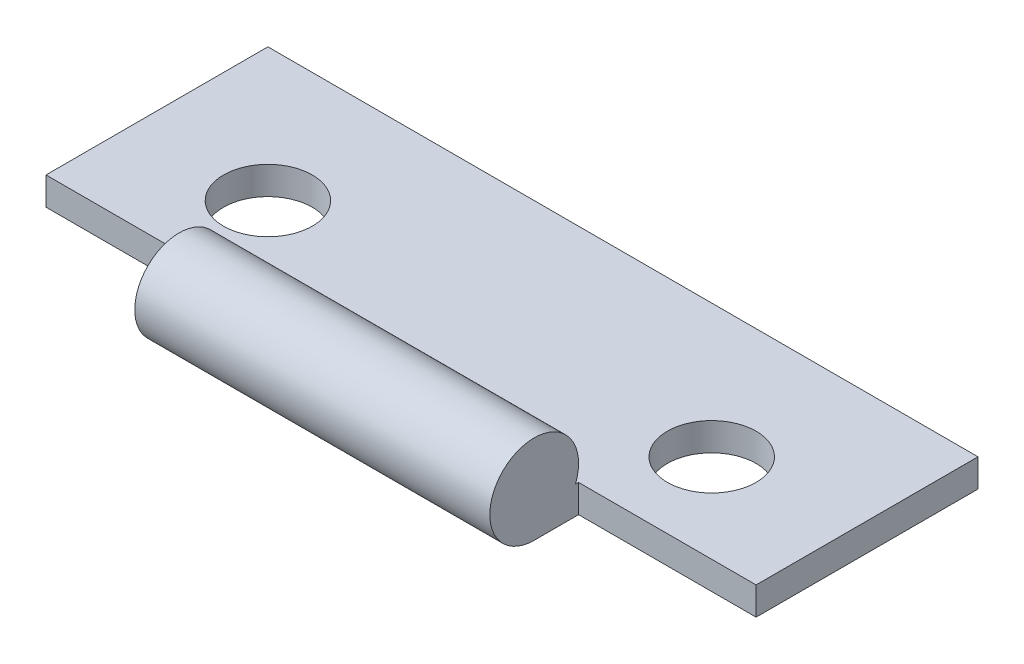
ISO-10303-21;
HEADER;
FILE_DESCRIPTION(('STEP AP214'),'2;1');
FILE_NAME('part.step','',(''),(''),'','','');
FILE_SCHEMA(('AUTOMOTIVE_DESIGN { 1 0 10303 214 1 1 1 1 }'));
ENDSEC;
DATA;
#1=APPLICATION_CONTEXT('core data for automotive mechanical design processes');
#2=APPLICATION_PROTOCOL_DEFINITION('international standard','automotive_design',2000,#1);
#3=PRODUCT_CONTEXT('',#1,'mechanical');
#4=PRODUCT('Part','Part','',(#3));
#5=PRODUCT_RELATED_PRODUCT_CATEGORY('part','',(#4));
#6=PRODUCT_DEFINITION_FORMATION('','',#4);
#7=PRODUCT_DEFINITION_CONTEXT('part definition',#1,'design');
#8=PRODUCT_DEFINITION('design','',#6,#7);
#9=PRODUCT_DEFINITION_SHAPE('','',#8);
#10=(LENGTH_UNIT() NAMED_UNIT(*) SI_UNIT(.MILLI.,.METRE.));
#11=(NAMED_UNIT(*) PLANE_ANGLE_UNIT() SI_UNIT($,.RADIAN.));
#12=(NAMED_UNIT(*) SI_UNIT($,.STERADIAN.) SOLID_ANGLE_UNIT());
#13=UNCERTAINTY_MEASURE_WITH_UNIT(LENGTH_MEASURE(1.E-05),#10,'distance_accuracy_value','');
#14=(GEOMETRIC_REPRESENTATION_CONTEXT(3) GLOBAL_UNCERTAINTY_ASSIGNED_CONTEXT((#13)) GLOBAL_UNIT_ASSIGNED_CONTEXT((#10,
#11,#12)) REPRESENTATION_CONTEXT('',''));
#15=CARTESIAN_POINT('',(0.,0.,0.));
#16=DIRECTION('',(0.,0.,1.));
#17=DIRECTION('',(1.,0.,0.));
#18=AXIS2_PLACEMENT_3D('',#15,#16,#17);
#19=CARTESIAN_POINT('',(0.,1.,0.));
#20=DIRECTION('',(0.,1.,0.));
#21=DIRECTION('',(0.,0.,1.));
#22=AXIS2_PLACEMENT_3D('',#19,#20,#21);
#23=PLANE('',#22);
#24=DIRECTION('',(-1.,0.,0.));
#25=VECTOR('',#24,1.);
#26=CARTESIAN_POINT('',(19.05,1.,-1.47478812037527));
#27=LINE('',#26,#25);
#28=CARTESIAN_POINT('',(19.05,1.,-1.47478812037527));
#29=VERTEX_POINT('',#28);
#30=CARTESIAN_POINT('',(6.35,1.,-1.47478812037527));
#31=VERTEX_POINT('',#30);
#32=EDGE_CURVE('E54',#29,#31,#27,.T.);
#33=ORIENTED_EDGE('',*,*,#32,.F.);
#34=DIRECTION('',(0.,0.,-1.));
#35=VECTOR('',#34,1.);
#36=CARTESIAN_POINT('',(19.05,1.,-1.58750000000001));
#37=LINE('',#36,#35);
#38=CARTESIAN_POINT('',(19.05,1.,-1.58750000000001));
#39=VERTEX_POINT('',#38);
#40=EDGE_CURVE('E137',#29,#39,#37,.T.);
#41=ORIENTED_EDGE('',*,*,#40,.T.);
#42=DIRECTION('',(1.,0.,0.));
#43=VECTOR('',#42,1.);
#44=CARTESIAN_POINT('',(25.4,1.,-1.58750000000001));
#45=LINE('',#44,#43);
#46=CARTESIAN_POINT('',(25.4,1.,-1.58750000000001));
#47=VERTEX_POINT('',#46);
#48=EDGE_CURVE('E140',#39,#47,#45,.T.);
#49=ORIENTED_EDGE('',*,*,#48,.T.);
#50=DIRECTION('',(0.,0.,-1.));
#51=VECTOR('',#50,1.);
#52=CARTESIAN_POINT('',(25.4,1.,-9.525));
#53=LINE('',#52,#51);
#54=CARTESIAN_POINT('',(25.4,1.,-9.525));
#55=VERTEX_POINT('',#54);
#56=EDGE_CURVE('E142',#47,#55,#53,.T.);
#57=ORIENTED_EDGE('',*,*,#56,.T.);
#58=DIRECTION('',(-1.,0.,0.));
#59=VECTOR('',#58,1.);
#60=CARTESIAN_POINT('',(0.,1.,-9.525));
#61=LINE('',#60,#59);
#62=CARTESIAN_POINT('',(0.,1.,-9.525));
#63=VERTEX_POINT('',#62);
#64=EDGE_CURVE('E144',#55,#63,#61,.T.);
#65=ORIENTED_EDGE('',*,*,#64,.T.);
#66=DIRECTION('',(0.,0.,1.));
#67=VECTOR('',#66,1.);
#68=CARTESIAN_POINT('',(0.,1.,-9.525));
#69=LINE('',#68,#67);
#70=CARTESIAN_POINT('',(0.,1.,-1.5875));
#71=VERTEX_POINT('',#70);
#72=EDGE_CURVE('E146',#63,#71,#69,.T.);
#73=ORIENTED_EDGE('',*,*,#72,.T.);
#74=DIRECTION('',(1.,0.,0.));
#75=VECTOR('',#74,1.);
#76=CARTESIAN_POINT('',(0.,1.,-1.5875));
#77=LINE('',#76,#75);
#78=CARTESIAN_POINT('',(6.35,1.,-1.5875));
#79=VERTEX_POINT('',#78);
#80=EDGE_CURVE('E148',#71,#79,#77,.T.);
#81=ORIENTED_EDGE('',*,*,#80,.T.);
#82=DIRECTION('',(0.,0.,1.));
#83=VECTOR('',#82,1.);
#84=CARTESIAN_POINT('',(6.35,1.,-1.5875));
#85=LINE('',#84,#83);
#86=EDGE_CURVE('E50',#79,#31,#85,.T.);
#87=ORIENTED_EDGE('',*,*,#86,.T.);
#88=EDGE_LOOP('',(#33,#41,#49,#57,#65,#73,#81,#87));
#89=FACE_BOUND('',#88,.T.);
#90=CARTESIAN_POINT('',(4.7625,1.,-4.7625));
#91=DIRECTION('',(0.,1.,0.));
#92=DIRECTION('',(0.,0.,1.));
#93=AXIS2_PLACEMENT_3D('',#90,#91,#92);
#94=CIRCLE('',#93,1.5875);
#95=CARTESIAN_POINT('',(4.7625,1.,-3.175));
#96=VERTEX_POINT('',#95);
#97=EDGE_CURVE('E108',#96,#96,#94,.T.);
#98=ORIENTED_EDGE('',*,*,#97,.F.);
#99=EDGE_LOOP('',(#98));
#100=FACE_BOUND('',#99,.T.);
#101=CARTESIAN_POINT('',(20.6375,1.,-4.7625));
#102=DIRECTION('',(0.,1.,0.));
#103=DIRECTION('',(0.,0.,-1.));
#104=AXIS2_PLACEMENT_3D('',#101,#102,#103);
#105=CIRCLE('',#104,1.5875);
#106=CARTESIAN_POINT('',(20.6375,1.,-6.35000000000001));
#107=VERTEX_POINT('',#106);
#108=EDGE_CURVE('E126',#107,#107,#105,.T.);
#109=ORIENTED_EDGE('',*,*,#108,.F.);
#110=EDGE_LOOP('',(#109));
#111=FACE_BOUND('',#110,.T.);
#112=ADVANCED_FACE('F35',(#89,#100,#111),#23,.T.);
#113=CARTESIAN_POINT('',(0.,0.,0.));
#114=DIRECTION('',(0.,1.,0.));
#115=DIRECTION('',(0.,0.,1.));
#116=AXIS2_PLACEMENT_3D('',#113,#114,#115);
#117=PLANE('',#116);
#118=DIRECTION('',(0.,0.,1.));
#119=VECTOR('',#118,1.);
#120=CARTESIAN_POINT('',(6.35,0.,-1.5875));
#121=LINE('',#120,#119);
#122=CARTESIAN_POINT('',(6.35,0.,-1.5875));
#123=VERTEX_POINT('',#122);
#124=CARTESIAN_POINT('',(6.35,0.,0.));
#125=VERTEX_POINT('',#124);
#126=EDGE_CURVE('E99',#123,#125,#121,.T.);
#127=ORIENTED_EDGE('',*,*,#126,.F.);
#128=DIRECTION('',(1.,0.,0.));
#129=VECTOR('',#128,1.);
#130=CARTESIAN_POINT('',(0.,0.,-1.5875));
#131=LINE('',#130,#129);
#132=CARTESIAN_POINT('',(0.,0.,-1.5875));
#133=VERTEX_POINT('',#132);
#134=EDGE_CURVE('E138',#133,#123,#131,.T.);
#135=ORIENTED_EDGE('',*,*,#134,.F.);
#136=DIRECTION('',(0.,0.,1.));
#137=VECTOR('',#136,1.);
#138=CARTESIAN_POINT('',(0.,0.,-9.525));
#139=LINE('',#138,#137);
#140=CARTESIAN_POINT('',(0.,0.,-9.525));
#141=VERTEX_POINT('',#140);
#142=EDGE_CURVE('E157',#141,#133,#139,.T.);
#143=ORIENTED_EDGE('',*,*,#142,.F.);
#144=DIRECTION('',(-1.,0.,0.));
#145=VECTOR('',#144,1.);
#146=CARTESIAN_POINT('',(0.,0.,-9.525));
#147=LINE('',#146,#145);
#148=CARTESIAN_POINT('',(25.4,0.,-9.525));
#149=VERTEX_POINT('',#148);
#150=EDGE_CURVE('E155',#149,#141,#147,.T.);
#151=ORIENTED_EDGE('',*,*,#150,.F.);
#152=DIRECTION('',(0.,0.,-1.));
#153=VECTOR('',#152,1.);
#154=CARTESIAN_POINT('',(25.4,0.,-9.525));
#155=LINE('',#154,#153);
#156=CARTESIAN_POINT('',(25.4,0.,-1.58750000000001));
#157=VERTEX_POINT('',#156);
#158=EDGE_CURVE('E153',#157,#149,#155,.T.);
#159=ORIENTED_EDGE('',*,*,#158,.F.);
#160=DIRECTION('',(1.,0.,0.));
#161=VECTOR('',#160,1.);
#162=CARTESIAN_POINT('',(25.4,0.,-1.58750000000001));
#163=LINE('',#162,#161);
#164=CARTESIAN_POINT('',(19.05,0.,-1.58750000000001));
#165=VERTEX_POINT('',#164);
#166=EDGE_CURVE('E151',#165,#157,#163,.T.);
#167=ORIENTED_EDGE('',*,*,#166,.F.);
#168=DIRECTION('',(0.,0.,-1.));
#169=VECTOR('',#168,1.);
#170=CARTESIAN_POINT('',(19.05,0.,-1.58750000000001));
#171=LINE('',#170,#169);
#172=CARTESIAN_POINT('',(19.05,0.,0.));
#173=VERTEX_POINT('',#172);
#174=EDGE_CURVE('E114',#173,#165,#171,.T.);
#175=ORIENTED_EDGE('',*,*,#174,.F.);
#176=DIRECTION('',(1.,0.,0.));
#177=VECTOR('',#176,1.);
#178=CARTESIAN_POINT('',(6.35,0.,0.));
#179=LINE('',#178,#177);
#180=EDGE_CURVE('E107',#125,#173,#179,.T.);
#181=ORIENTED_EDGE('',*,*,#180,.F.);
#182=EDGE_LOOP('',(#127,#135,#143,#151,#159,#167,#175,#181));
#183=FACE_BOUND('',#182,.T.);
#184=CARTESIAN_POINT('',(4.7625,0.,-4.7625));
#185=DIRECTION('',(0.,1.,0.));
#186=DIRECTION('',(0.,0.,1.));
#187=AXIS2_PLACEMENT_3D('',#184,#185,#186);
#188=CIRCLE('',#187,1.5875);
#189=CARTESIAN_POINT('',(4.7625,0.,-3.175));
#190=VERTEX_POINT('',#189);
#191=EDGE_CURVE('E129',#190,#190,#188,.T.);
#192=ORIENTED_EDGE('',*,*,#191,.T.);
#193=EDGE_LOOP('',(#192));
#194=FACE_BOUND('',#193,.T.);
#195=CARTESIAN_POINT('',(20.6375,0.,-4.7625));
#196=DIRECTION('',(0.,1.,0.));
#197=DIRECTION('',(0.,0.,-1.));
#198=AXIS2_PLACEMENT_3D('',#195,#196,#197);
#199=CIRCLE('',#198,1.5875);
#200=CARTESIAN_POINT('',(20.6375,0.,-6.35000000000001));
#201=VERTEX_POINT('',#200);
#202=EDGE_CURVE('E125',#201,#201,#199,.T.);
#203=ORIENTED_EDGE('',*,*,#202,.T.);
#204=EDGE_LOOP('',(#203));
#205=FACE_BOUND('',#204,.T.);
#206=ADVANCED_FACE('F111',(#183,#194,#205),#117,.F.);
#207=CARTESIAN_POINT('',(6.35,1.,-1.5875));
#208=DIRECTION('',(1.,0.,0.));
#209=DIRECTION('',(0.,0.,-1.));
#210=AXIS2_PLACEMENT_3D('',#207,#208,#209);
#211=PLANE('',#210);
#212=ORIENTED_EDGE('',*,*,#126,.T.);
#213=CARTESIAN_POINT('',(6.35,1.5875,0.));
#214=DIRECTION('',(-1.,0.,0.));
#215=DIRECTION('',(0.,0.,1.));
#216=AXIS2_PLACEMENT_3D('',#213,#214,#215);
#217=CIRCLE('',#216,1.5875);
#218=EDGE_CURVE('E102',#125,#31,#217,.T.);
#219=ORIENTED_EDGE('',*,*,#218,.T.);
#220=ORIENTED_EDGE('',*,*,#86,.F.);
#221=DIRECTION('',(0.,-1.,0.));
#222=VECTOR('',#221,1.);
#223=CARTESIAN_POINT('',(6.35,1.,-1.5875));
#224=LINE('',#223,#222);
#225=EDGE_CURVE('E104',#79,#123,#224,.T.);
#226=ORIENTED_EDGE('',*,*,#225,.T.);
#227=EDGE_LOOP('',(#212,#219,#220,#226));
#228=FACE_BOUND('',#227,.T.);
#229=ADVANCED_FACE('F37',(#228),#211,.F.);
#230=CARTESIAN_POINT('',(19.05,1.,-1.58750000000001));
#231=DIRECTION('',(-1.,0.,0.));
#232=DIRECTION('',(0.,0.,1.));
#233=AXIS2_PLACEMENT_3D('',#230,#231,#232);
#234=PLANE('',#233);
#235=ORIENTED_EDGE('',*,*,#40,.F.);
#236=CARTESIAN_POINT('',(19.05,1.5875,0.));
#237=DIRECTION('',(-1.,0.,0.));
#238=DIRECTION('',(0.,0.,1.));
#239=AXIS2_PLACEMENT_3D('',#236,#237,#238);
#240=CIRCLE('',#239,1.5875);
#241=EDGE_CURVE('E120',#173,#29,#240,.T.);
#242=ORIENTED_EDGE('',*,*,#241,.F.);
#243=ORIENTED_EDGE('',*,*,#174,.T.);
#244=DIRECTION('',(0.,-1.,0.));
#245=VECTOR('',#244,1.);
#246=CARTESIAN_POINT('',(19.05,1.,-1.58750000000001));
#247=LINE('',#246,#245);
#248=EDGE_CURVE('E11',#39,#165,#247,.T.);
#249=ORIENTED_EDGE('',*,*,#248,.F.);
#250=EDGE_LOOP('',(#235,#242,#243,#249));
#251=FACE_BOUND('',#250,.T.);
#252=ADVANCED_FACE('F193',(#251),#234,.F.);
#253=CARTESIAN_POINT('',(25.4,1.,-1.58750000000001));
#254=DIRECTION('',(0.,0.,-1.));
#255=DIRECTION('',(-1.,0.,0.));
#256=AXIS2_PLACEMENT_3D('',#253,#254,#255);
#257=PLANE('',#256);
#258=ORIENTED_EDGE('',*,*,#166,.T.);
#259=DIRECTION('',(0.,-1.,0.));
#260=VECTOR('',#259,1.);
#261=CARTESIAN_POINT('',(25.4,1.,-1.58750000000001));
#262=LINE('',#261,#260);
#263=EDGE_CURVE('E43',#47,#157,#262,.T.);
#264=ORIENTED_EDGE('',*,*,#263,.F.);
#265=ORIENTED_EDGE('',*,*,#48,.F.);
#266=ORIENTED_EDGE('',*,*,#248,.T.);
#267=EDGE_LOOP('',(#258,#264,#265,#266));
#268=FACE_BOUND('',#267,.T.);
#269=ADVANCED_FACE('F191',(#268),#257,.F.);
#270=CARTESIAN_POINT('',(25.4,1.,-9.525));
#271=DIRECTION('',(-1.,0.,0.));
#272=DIRECTION('',(0.,0.,1.));
#273=AXIS2_PLACEMENT_3D('',#270,#271,#272);
#274=PLANE('',#273);
#275=ORIENTED_EDGE('',*,*,#158,.T.);
#276=DIRECTION('',(0.,-1.,0.));
#277=VECTOR('',#276,1.);
#278=CARTESIAN_POINT('',(25.4,1.,-9.525));
#279=LINE('',#278,#277);
#280=EDGE_CURVE('E167',#55,#149,#279,.T.);
#281=ORIENTED_EDGE('',*,*,#280,.F.);
#282=ORIENTED_EDGE('',*,*,#56,.F.);
#283=ORIENTED_EDGE('',*,*,#263,.T.);
#284=EDGE_LOOP('',(#275,#281,#282,#283));
#285=FACE_BOUND('',#284,.T.);
#286=ADVANCED_FACE('F174',(#285),#274,.F.);
#287=CARTESIAN_POINT('',(0.,1.,-9.525));
#288=DIRECTION('',(0.,0.,1.));
#289=DIRECTION('',(1.,0.,0.));
#290=AXIS2_PLACEMENT_3D('',#287,#288,#289);
#291=PLANE('',#290);
#292=ORIENTED_EDGE('',*,*,#150,.T.);
#293=DIRECTION('',(0.,-1.,0.));
#294=VECTOR('',#293,1.);
#295=CARTESIAN_POINT('',(0.,1.,-9.525));
#296=LINE('',#295,#294);
#297=EDGE_CURVE('E164',#63,#141,#296,.T.);
#298=ORIENTED_EDGE('',*,*,#297,.F.);
#299=ORIENTED_EDGE('',*,*,#64,.F.);
#300=ORIENTED_EDGE('',*,*,#280,.T.);
#301=EDGE_LOOP('',(#292,#298,#299,#300));
#302=FACE_BOUND('',#301,.T.);
#303=ADVANCED_FACE('F182',(#302),#291,.F.);
#304=CARTESIAN_POINT('',(0.,1.,-9.525));
#305=DIRECTION('',(1.,0.,0.));
#306=DIRECTION('',(0.,0.,-1.));
#307=AXIS2_PLACEMENT_3D('',#304,#305,#306);
#308=PLANE('',#307);
#309=ORIENTED_EDGE('',*,*,#142,.T.);
#310=DIRECTION('',(0.,-1.,0.));
#311=VECTOR('',#310,1.);
#312=CARTESIAN_POINT('',(0.,1.,-1.5875));
#313=LINE('',#312,#311);
#314=EDGE_CURVE('E161',#71,#133,#313,.T.);
#315=ORIENTED_EDGE('',*,*,#314,.F.);
#316=ORIENTED_EDGE('',*,*,#72,.F.);
#317=ORIENTED_EDGE('',*,*,#297,.T.);
#318=EDGE_LOOP('',(#309,#315,#316,#317));
#319=FACE_BOUND('',#318,.T.);
#320=ADVANCED_FACE('F186',(#319),#308,.F.);
#321=CARTESIAN_POINT('',(0.,1.,-1.5875));
#322=DIRECTION('',(0.,0.,-1.));
#323=DIRECTION('',(-1.,0.,0.));
#324=AXIS2_PLACEMENT_3D('',#321,#322,#323);
#325=PLANE('',#324);
#326=ORIENTED_EDGE('',*,*,#134,.T.);
#327=ORIENTED_EDGE('',*,*,#225,.F.);
#328=ORIENTED_EDGE('',*,*,#80,.F.);
#329=ORIENTED_EDGE('',*,*,#314,.T.);
#330=EDGE_LOOP('',(#326,#327,#328,#329));
#331=FACE_BOUND('',#330,.T.);
#332=ADVANCED_FACE('F210',(#331),#325,.F.);
#333=CARTESIAN_POINT('',(4.7625,1.,-4.7625));
#334=DIRECTION('',(0.,-1.,0.));
#335=DIRECTION('',(0.,0.,-1.));
#336=AXIS2_PLACEMENT_3D('',#333,#334,#335);
#337=CYLINDRICAL_SURFACE('',#336,1.5875);
#338=ORIENTED_EDGE('',*,*,#97,.T.);
#339=EDGE_LOOP('',(#338));
#340=FACE_BOUND('',#339,.T.);
#341=ORIENTED_EDGE('',*,*,#191,.F.);
#342=EDGE_LOOP('',(#341));
#343=FACE_BOUND('',#342,.T.);
#344=ADVANCED_FACE('F207',(#340,#343),#337,.F.);
#345=CARTESIAN_POINT('',(20.6375,1.,-4.7625));
#346=DIRECTION('',(0.,-1.,0.));
#347=DIRECTION('',(0.,0.,-1.));
#348=AXIS2_PLACEMENT_3D('',#345,#346,#347);
#349=CYLINDRICAL_SURFACE('',#348,1.5875);
#350=ORIENTED_EDGE('',*,*,#108,.T.);
#351=EDGE_LOOP('',(#350));
#352=FACE_BOUND('',#351,.T.);
#353=ORIENTED_EDGE('',*,*,#202,.F.);
#354=EDGE_LOOP('',(#353));
#355=FACE_BOUND('',#354,.T.);
#356=ADVANCED_FACE('F241',(#352,#355),#349,.F.);
#357=CARTESIAN_POINT('',(19.05,1.5875,0.));
#358=DIRECTION('',(-1.,0.,0.));
#359=DIRECTION('',(0.,0.,1.));
#360=AXIS2_PLACEMENT_3D('',#357,#358,#359);
#361=CYLINDRICAL_SURFACE('',#360,1.5875);
#362=ORIENTED_EDGE('',*,*,#241,.T.);
#363=ORIENTED_EDGE('',*,*,#32,.T.);
#364=ORIENTED_EDGE('',*,*,#218,.F.);
#365=ORIENTED_EDGE('',*,*,#180,.T.);
#366=EDGE_LOOP('',(#362,#363,#364,#365));
#367=FACE_BOUND('',#366,.T.);
#368=ADVANCED_FACE('F119',(#367),#361,.T.);
#369=CLOSED_SHELL('',(#112,#206,#229,#252,#269,#286,#303,#320,#332,#344,#356,#368));
#370=MANIFOLD_SOLID_BREP('B2',#369);
#371=ADVANCED_BREP_SHAPE_REPRESENTATION('',(#18,#370),#14);
#372=SHAPE_DEFINITION_REPRESENTATION(#9,#371);
ENDSEC;
END-ISO-10303-21;
